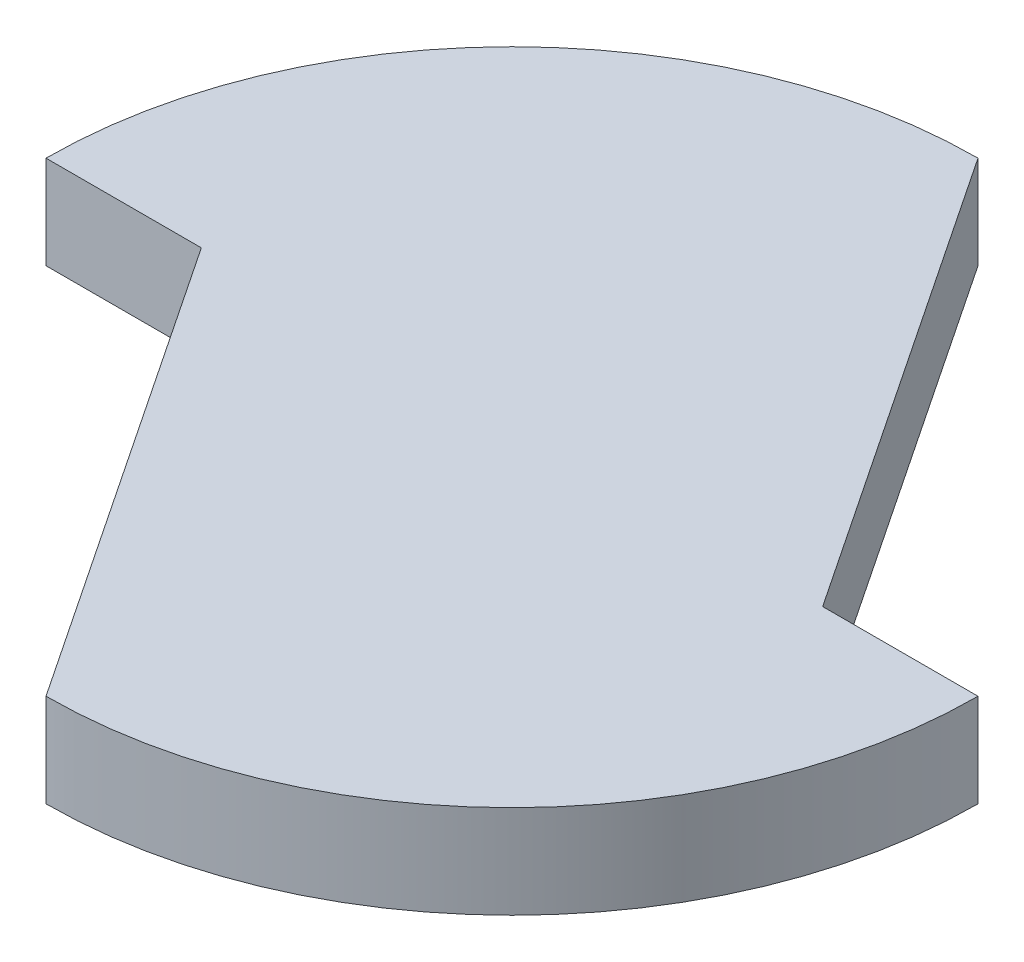
ISO-10303-21;
HEADER;
FILE_DESCRIPTION(('STEP AP214'),'2;1');
FILE_NAME('part.step','',(''),(''),'','','');
FILE_SCHEMA(('AUTOMOTIVE_DESIGN { 1 0 10303 214 1 1 1 1 }'));
ENDSEC;
DATA;
#1=APPLICATION_CONTEXT('core data for automotive mechanical design processes');
#2=APPLICATION_PROTOCOL_DEFINITION('international standard','automotive_design',2000,#1);
#3=PRODUCT_CONTEXT('',#1,'mechanical');
#4=PRODUCT('Part','Part','',(#3));
#5=PRODUCT_RELATED_PRODUCT_CATEGORY('part','',(#4));
#6=PRODUCT_DEFINITION_FORMATION('','',#4);
#7=PRODUCT_DEFINITION_CONTEXT('part definition',#1,'design');
#8=PRODUCT_DEFINITION('design','',#6,#7);
#9=PRODUCT_DEFINITION_SHAPE('','',#8);
#10=(LENGTH_UNIT() NAMED_UNIT(*) SI_UNIT(.MILLI.,.METRE.));
#11=(NAMED_UNIT(*) PLANE_ANGLE_UNIT() SI_UNIT($,.RADIAN.));
#12=(NAMED_UNIT(*) SI_UNIT($,.STERADIAN.) SOLID_ANGLE_UNIT());
#13=UNCERTAINTY_MEASURE_WITH_UNIT(LENGTH_MEASURE(1.E-05),#10,'distance_accuracy_value','');
#14=(GEOMETRIC_REPRESENTATION_CONTEXT(3) GLOBAL_UNCERTAINTY_ASSIGNED_CONTEXT((#13)) GLOBAL_UNIT_ASSIGNED_CONTEXT((#10,
#11,#12)) REPRESENTATION_CONTEXT('',''));
#15=CARTESIAN_POINT('',(0.,0.,0.));
#16=DIRECTION('',(0.,0.,1.));
#17=DIRECTION('',(1.,0.,0.));
#18=AXIS2_PLACEMENT_3D('',#15,#16,#17);
#19=CARTESIAN_POINT('',(0.,3.,0.));
#20=DIRECTION('',(0.,-1.,0.));
#21=DIRECTION('',(0.,0.,-1.));
#22=AXIS2_PLACEMENT_3D('',#19,#20,#21);
#23=CYLINDRICAL_SURFACE('',#22,15.);
#24=DIRECTION('',(0.,1.,0.));
#25=VECTOR('',#24,1.);
#26=CARTESIAN_POINT('',(0.,-5.,-15.));
#27=LINE('',#26,#25);
#28=CARTESIAN_POINT('',(0.,0.,-15.));
#29=VERTEX_POINT('',#28);
#30=CARTESIAN_POINT('',(0.,3.,-15.));
#31=VERTEX_POINT('',#30);
#32=EDGE_CURVE('E101',#29,#31,#27,.T.);
#33=ORIENTED_EDGE('',*,*,#32,.F.);
#34=CARTESIAN_POINT('',(0.,0.,0.));
#35=DIRECTION('',(0.,1.,0.));
#36=DIRECTION('',(0.,0.,1.));
#37=AXIS2_PLACEMENT_3D('',#34,#35,#36);
#38=CIRCLE('',#37,15.);
#39=CARTESIAN_POINT('',(-15.,0.,0.));
#40=VERTEX_POINT('',#39);
#41=EDGE_CURVE('E122',#29,#40,#38,.T.);
#42=ORIENTED_EDGE('',*,*,#41,.T.);
#43=DIRECTION('',(0.,1.,0.));
#44=VECTOR('',#43,1.);
#45=CARTESIAN_POINT('',(-15.,-5.,0.));
#46=LINE('',#45,#44);
#47=CARTESIAN_POINT('',(-15.,3.,0.));
#48=VERTEX_POINT('',#47);
#49=EDGE_CURVE('E54',#40,#48,#46,.T.);
#50=ORIENTED_EDGE('',*,*,#49,.T.);
#51=CARTESIAN_POINT('',(0.,3.,0.));
#52=DIRECTION('',(0.,1.,0.));
#53=DIRECTION('',(0.,0.,1.));
#54=AXIS2_PLACEMENT_3D('',#51,#52,#53);
#55=CIRCLE('',#54,15.);
#56=EDGE_CURVE('E127',#31,#48,#55,.T.);
#57=ORIENTED_EDGE('',*,*,#56,.F.);
#58=EDGE_LOOP('',(#33,#42,#50,#57));
#59=FACE_BOUND('',#58,.T.);
#60=ADVANCED_FACE('F40',(#59),#23,.T.);
#61=CARTESIAN_POINT('',(0.,0.,15.));
#62=VERTEX_POINT('',#61);
#63=CARTESIAN_POINT('',(15.,0.,0.));
#64=VERTEX_POINT('',#63);
#65=EDGE_CURVE('E128',#62,#64,#38,.T.);
#66=ORIENTED_EDGE('',*,*,#65,.T.);
#67=DIRECTION('',(0.,1.,0.));
#68=VECTOR('',#67,1.);
#69=CARTESIAN_POINT('',(15.,-5.,0.));
#70=LINE('',#69,#68);
#71=CARTESIAN_POINT('',(15.,3.,0.));
#72=VERTEX_POINT('',#71);
#73=EDGE_CURVE('E62',#64,#72,#70,.T.);
#74=ORIENTED_EDGE('',*,*,#73,.T.);
#75=CARTESIAN_POINT('',(0.,3.,15.));
#76=VERTEX_POINT('',#75);
#77=EDGE_CURVE('E110',#76,#72,#55,.T.);
#78=ORIENTED_EDGE('',*,*,#77,.F.);
#79=DIRECTION('',(0.,1.,0.));
#80=VECTOR('',#79,1.);
#81=CARTESIAN_POINT('',(0.,-5.,15.));
#82=LINE('',#81,#80);
#83=EDGE_CURVE('E120',#62,#76,#82,.T.);
#84=ORIENTED_EDGE('',*,*,#83,.F.);
#85=EDGE_LOOP('',(#66,#74,#78,#84));
#86=FACE_BOUND('',#85,.T.);
#87=ADVANCED_FACE('F140',(#86),#23,.T.);
#88=CARTESIAN_POINT('',(0.,3.,0.));
#89=DIRECTION('',(0.,1.,0.));
#90=DIRECTION('',(0.,0.,1.));
#91=AXIS2_PLACEMENT_3D('',#88,#89,#90);
#92=PLANE('',#91);
#93=DIRECTION('',(1.,0.,0.));
#94=VECTOR('',#93,1.);
#95=CARTESIAN_POINT('',(0.,3.,0.));
#96=LINE('',#95,#94);
#97=CARTESIAN_POINT('',(10.,3.,0.));
#98=VERTEX_POINT('',#97);
#99=EDGE_CURVE('E93',#98,#72,#96,.T.);
#100=ORIENTED_EDGE('',*,*,#99,.F.);
#101=DIRECTION('',(-0.554700196225229,0.,-0.832050294337844));
#102=VECTOR('',#101,1.);
#103=CARTESIAN_POINT('',(6.92307692307692,3.,-4.61538461538462));
#104=LINE('',#103,#102);
#105=EDGE_CURVE('E98',#98,#31,#104,.T.);
#106=ORIENTED_EDGE('',*,*,#105,.T.);
#107=ORIENTED_EDGE('',*,*,#56,.T.);
#108=DIRECTION('',(-1.,0.,0.));
#109=VECTOR('',#108,1.);
#110=CARTESIAN_POINT('',(0.,3.,0.));
#111=LINE('',#110,#109);
#112=CARTESIAN_POINT('',(-10.,3.,0.));
#113=VERTEX_POINT('',#112);
#114=EDGE_CURVE('E117',#113,#48,#111,.T.);
#115=ORIENTED_EDGE('',*,*,#114,.F.);
#116=DIRECTION('',(0.554700196225229,0.,0.832050294337844));
#117=VECTOR('',#116,1.);
#118=CARTESIAN_POINT('',(-6.92307692307692,3.,4.61538461538462));
#119=LINE('',#118,#117);
#120=EDGE_CURVE('E114',#113,#76,#119,.T.);
#121=ORIENTED_EDGE('',*,*,#120,.T.);
#122=ORIENTED_EDGE('',*,*,#77,.T.);
#123=EDGE_LOOP('',(#100,#106,#107,#115,#121,#122));
#124=FACE_BOUND('',#123,.T.);
#125=ADVANCED_FACE('F107',(#124),#92,.T.);
#126=CARTESIAN_POINT('',(0.,0.,0.));
#127=DIRECTION('',(0.,1.,0.));
#128=DIRECTION('',(0.,0.,1.));
#129=AXIS2_PLACEMENT_3D('',#126,#127,#128);
#130=PLANE('',#129);
#131=DIRECTION('',(-0.554700196225229,0.,-0.832050294337844));
#132=VECTOR('',#131,1.);
#133=CARTESIAN_POINT('',(6.92307692307692,0.,-4.61538461538461));
#134=LINE('',#133,#132);
#135=CARTESIAN_POINT('',(10.,0.,0.));
#136=VERTEX_POINT('',#135);
#137=EDGE_CURVE('E12',#136,#29,#134,.T.);
#138=ORIENTED_EDGE('',*,*,#137,.F.);
#139=DIRECTION('',(1.,0.,0.));
#140=VECTOR('',#139,1.);
#141=CARTESIAN_POINT('',(0.,0.,0.));
#142=LINE('',#141,#140);
#143=EDGE_CURVE('E47',#136,#64,#142,.T.);
#144=ORIENTED_EDGE('',*,*,#143,.T.);
#145=ORIENTED_EDGE('',*,*,#65,.F.);
#146=DIRECTION('',(0.554700196225229,0.,0.832050294337844));
#147=VECTOR('',#146,1.);
#148=CARTESIAN_POINT('',(-6.92307692307692,0.,4.61538461538462));
#149=LINE('',#148,#147);
#150=CARTESIAN_POINT('',(-10.,0.,0.));
#151=VERTEX_POINT('',#150);
#152=EDGE_CURVE('E132',#151,#62,#149,.T.);
#153=ORIENTED_EDGE('',*,*,#152,.F.);
#154=DIRECTION('',(-1.,0.,0.));
#155=VECTOR('',#154,1.);
#156=CARTESIAN_POINT('',(0.,0.,0.));
#157=LINE('',#156,#155);
#158=EDGE_CURVE('E126',#151,#40,#157,.T.);
#159=ORIENTED_EDGE('',*,*,#158,.T.);
#160=ORIENTED_EDGE('',*,*,#41,.F.);
#161=EDGE_LOOP('',(#138,#144,#145,#153,#159,#160));
#162=FACE_BOUND('',#161,.T.);
#163=ADVANCED_FACE('F135',(#162),#130,.F.);
#164=CARTESIAN_POINT('',(-6.92307692307692,-5.,4.61538461538462));
#165=DIRECTION('',(-0.832050294337844,0.,0.554700196225229));
#166=DIRECTION('',(0.554700196225229,0.,0.832050294337844));
#167=AXIS2_PLACEMENT_3D('',#164,#165,#166);
#168=PLANE('',#167);
#169=ORIENTED_EDGE('',*,*,#152,.T.);
#170=ORIENTED_EDGE('',*,*,#83,.T.);
#171=ORIENTED_EDGE('',*,*,#120,.F.);
#172=DIRECTION('',(0.,1.,0.));
#173=VECTOR('',#172,1.);
#174=CARTESIAN_POINT('',(-10.,-5.,0.));
#175=LINE('',#174,#173);
#176=EDGE_CURVE('E119',#151,#113,#175,.T.);
#177=ORIENTED_EDGE('',*,*,#176,.F.);
#178=EDGE_LOOP('',(#169,#170,#171,#177));
#179=FACE_BOUND('',#178,.T.);
#180=ADVANCED_FACE('F143',(#179),#168,.T.);
#181=CARTESIAN_POINT('',(0.,-5.,0.));
#182=DIRECTION('',(0.,0.,-1.));
#183=DIRECTION('',(-1.,0.,0.));
#184=AXIS2_PLACEMENT_3D('',#181,#182,#183);
#185=PLANE('',#184);
#186=ORIENTED_EDGE('',*,*,#176,.T.);
#187=ORIENTED_EDGE('',*,*,#114,.T.);
#188=ORIENTED_EDGE('',*,*,#49,.F.);
#189=ORIENTED_EDGE('',*,*,#158,.F.);
#190=EDGE_LOOP('',(#186,#187,#188,#189));
#191=FACE_BOUND('',#190,.T.);
#192=ADVANCED_FACE('F146',(#191),#185,.F.);
#193=CARTESIAN_POINT('',(6.92307692307692,-5.,-4.61538461538462));
#194=DIRECTION('',(0.832050294337844,0.,-0.554700196225229));
#195=DIRECTION('',(-0.554700196225229,0.,-0.832050294337844));
#196=AXIS2_PLACEMENT_3D('',#193,#194,#195);
#197=PLANE('',#196);
#198=ORIENTED_EDGE('',*,*,#137,.T.);
#199=ORIENTED_EDGE('',*,*,#32,.T.);
#200=ORIENTED_EDGE('',*,*,#105,.F.);
#201=DIRECTION('',(0.,1.,0.));
#202=VECTOR('',#201,1.);
#203=CARTESIAN_POINT('',(10.,-5.,0.));
#204=LINE('',#203,#202);
#205=EDGE_CURVE('E89',#136,#98,#204,.T.);
#206=ORIENTED_EDGE('',*,*,#205,.F.);
#207=EDGE_LOOP('',(#198,#199,#200,#206));
#208=FACE_BOUND('',#207,.T.);
#209=ADVANCED_FACE('F99',(#208),#197,.T.);
#210=CARTESIAN_POINT('',(0.,-5.,0.));
#211=DIRECTION('',(0.,0.,1.));
#212=DIRECTION('',(1.,0.,0.));
#213=AXIS2_PLACEMENT_3D('',#210,#211,#212);
#214=PLANE('',#213);
#215=ORIENTED_EDGE('',*,*,#205,.T.);
#216=ORIENTED_EDGE('',*,*,#99,.T.);
#217=ORIENTED_EDGE('',*,*,#73,.F.);
#218=ORIENTED_EDGE('',*,*,#143,.F.);
#219=EDGE_LOOP('',(#215,#216,#217,#218));
#220=FACE_BOUND('',#219,.T.);
#221=ADVANCED_FACE('F91',(#220),#214,.F.);
#222=CLOSED_SHELL('',(#60,#87,#125,#163,#180,#192,#209,#221));
#223=MANIFOLD_SOLID_BREP('B2',#222);
#224=ADVANCED_BREP_SHAPE_REPRESENTATION('',(#18,#223),#14);
#225=SHAPE_DEFINITION_REPRESENTATION(#9,#224);
ENDSEC;
END-ISO-10303-21;
